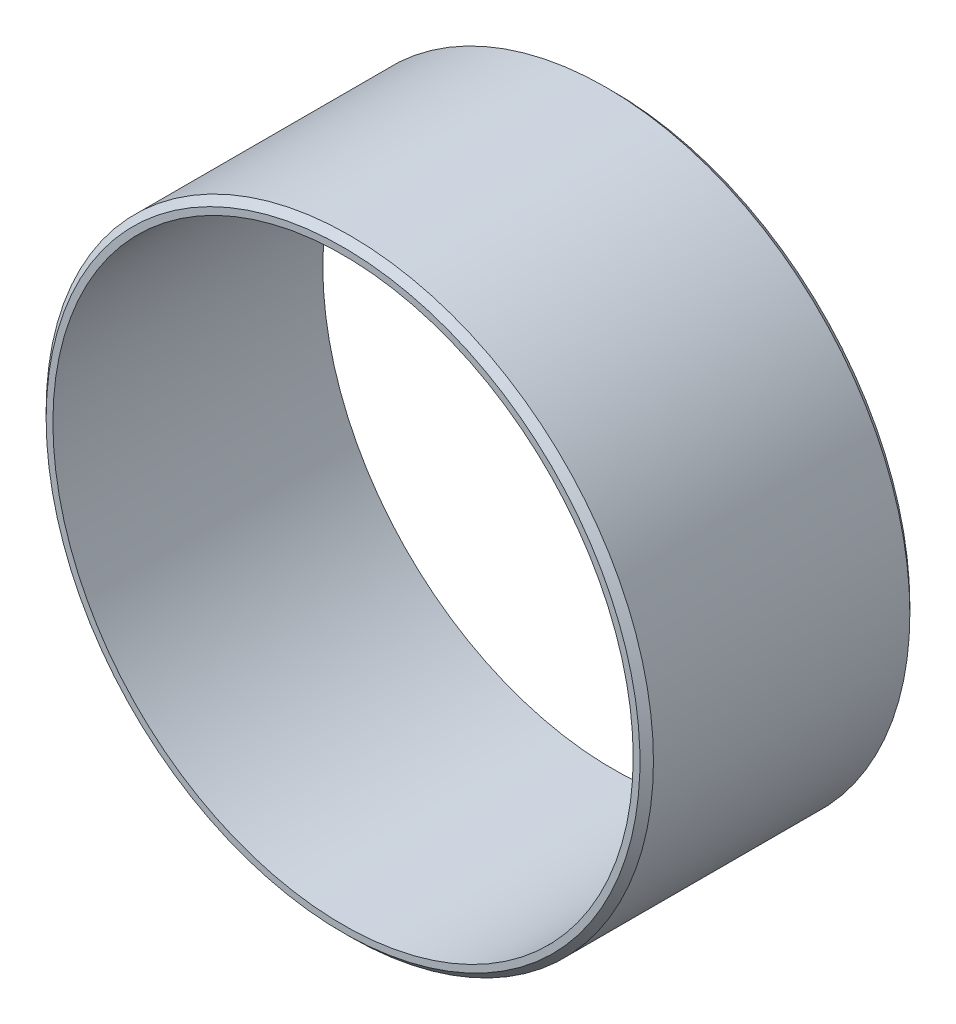
ISO-10303-21;
HEADER;
FILE_DESCRIPTION(('STEP AP214'),'2;1');
FILE_NAME('part.step','',(''),(''),'','','');
FILE_SCHEMA(('AUTOMOTIVE_DESIGN { 1 0 10303 214 1 1 1 1 }'));
ENDSEC;
DATA;
#1=APPLICATION_CONTEXT('core data for automotive mechanical design processes');
#2=APPLICATION_PROTOCOL_DEFINITION('international standard','automotive_design',2000,#1);
#3=PRODUCT_CONTEXT('',#1,'mechanical');
#4=PRODUCT('Part','Part','',(#3));
#5=PRODUCT_RELATED_PRODUCT_CATEGORY('part','',(#4));
#6=PRODUCT_DEFINITION_FORMATION('','',#4);
#7=PRODUCT_DEFINITION_CONTEXT('part definition',#1,'design');
#8=PRODUCT_DEFINITION('design','',#6,#7);
#9=PRODUCT_DEFINITION_SHAPE('','',#8);
#10=(LENGTH_UNIT() NAMED_UNIT(*) SI_UNIT(.MILLI.,.METRE.));
#11=(NAMED_UNIT(*) PLANE_ANGLE_UNIT() SI_UNIT($,.RADIAN.));
#12=(NAMED_UNIT(*) SI_UNIT($,.STERADIAN.) SOLID_ANGLE_UNIT());
#13=UNCERTAINTY_MEASURE_WITH_UNIT(LENGTH_MEASURE(1.E-05),#10,'distance_accuracy_value','');
#14=(GEOMETRIC_REPRESENTATION_CONTEXT(3) GLOBAL_UNCERTAINTY_ASSIGNED_CONTEXT((#13)) GLOBAL_UNIT_ASSIGNED_CONTEXT((#10,
#11,#12)) REPRESENTATION_CONTEXT('',''));
#15=CARTESIAN_POINT('',(0.,0.,0.));
#16=DIRECTION('',(0.,0.,1.));
#17=DIRECTION('',(1.,0.,0.));
#18=AXIS2_PLACEMENT_3D('',#15,#16,#17);
#19=CARTESIAN_POINT('',(0.,0.,40.));
#20=DIRECTION('',(0.,0.,-1.));
#21=DIRECTION('',(-1.,0.,0.));
#22=AXIS2_PLACEMENT_3D('',#19,#20,#21);
#23=CYLINDRICAL_SURFACE('',#22,45.);
#24=CARTESIAN_POINT('',(0.,0.,1.00000000000003));
#25=DIRECTION('',(0.,0.,1.));
#26=DIRECTION('',(1.,0.,0.));
#27=AXIS2_PLACEMENT_3D('',#24,#25,#26);
#28=CIRCLE('',#27,45.);
#29=CARTESIAN_POINT('',(45.,0.,1.00000000000003));
#30=VERTEX_POINT('',#29);
#31=EDGE_CURVE('E30',#30,#30,#28,.F.);
#32=ORIENTED_EDGE('',*,*,#31,.F.);
#33=EDGE_LOOP('',(#32));
#34=FACE_BOUND('',#33,.T.);
#35=CARTESIAN_POINT('',(0.,0.,39.));
#36=DIRECTION('',(0.,0.,-1.));
#37=DIRECTION('',(-1.,0.,0.));
#38=AXIS2_PLACEMENT_3D('',#35,#36,#37);
#39=CIRCLE('',#38,45.);
#40=CARTESIAN_POINT('',(-45.,0.,39.));
#41=VERTEX_POINT('',#40);
#42=EDGE_CURVE('E36',#41,#41,#39,.F.);
#43=ORIENTED_EDGE('',*,*,#42,.F.);
#44=EDGE_LOOP('',(#43));
#45=FACE_BOUND('',#44,.T.);
#46=ADVANCED_FACE('F15',(#34,#45),#23,.T.);
#47=CARTESIAN_POINT('',(0.,0.,1.00000000000003));
#48=DIRECTION('',(0.,0.,1.));
#49=DIRECTION('',(1.,0.,0.));
#50=AXIS2_PLACEMENT_3D('',#47,#48,#49);
#51=CONICAL_SURFACE('',#50,45.,0.785398163397452);
#52=CARTESIAN_POINT('',(0.,0.,0.));
#53=DIRECTION('',(0.,0.,1.));
#54=DIRECTION('',(1.,0.,0.));
#55=AXIS2_PLACEMENT_3D('',#52,#53,#54);
#56=CIRCLE('',#55,44.);
#57=CARTESIAN_POINT('',(44.,0.,0.));
#58=VERTEX_POINT('',#57);
#59=EDGE_CURVE('E18',#58,#58,#56,.T.);
#60=ORIENTED_EDGE('',*,*,#59,.T.);
#61=EDGE_LOOP('',(#60));
#62=FACE_BOUND('',#61,.T.);
#63=ORIENTED_EDGE('',*,*,#31,.T.);
#64=EDGE_LOOP('',(#63));
#65=FACE_BOUND('',#64,.T.);
#66=ADVANCED_FACE('F45',(#62,#65),#51,.T.);
#67=CARTESIAN_POINT('',(0.,0.,39.));
#68=DIRECTION('',(0.,0.,-1.));
#69=DIRECTION('',(-1.,0.,0.));
#70=AXIS2_PLACEMENT_3D('',#67,#68,#69);
#71=CONICAL_SURFACE('',#70,45.,0.785398163397452);
#72=ORIENTED_EDGE('',*,*,#42,.T.);
#73=EDGE_LOOP('',(#72));
#74=FACE_BOUND('',#73,.T.);
#75=CARTESIAN_POINT('',(0.,0.,40.));
#76=DIRECTION('',(0.,0.,-1.));
#77=DIRECTION('',(-1.,0.,0.));
#78=AXIS2_PLACEMENT_3D('',#75,#76,#77);
#79=CIRCLE('',#78,44.);
#80=CARTESIAN_POINT('',(-44.,0.,40.));
#81=VERTEX_POINT('',#80);
#82=EDGE_CURVE('E27',#81,#81,#79,.F.);
#83=ORIENTED_EDGE('',*,*,#82,.F.);
#84=EDGE_LOOP('',(#83));
#85=FACE_BOUND('',#84,.T.);
#86=ADVANCED_FACE('F53',(#74,#85),#71,.T.);
#87=CARTESIAN_POINT('',(0.,0.,0.));
#88=DIRECTION('',(0.,0.,1.));
#89=DIRECTION('',(1.,0.,0.));
#90=AXIS2_PLACEMENT_3D('',#87,#88,#89);
#91=PLANE('',#90);
#92=CARTESIAN_POINT('',(0.,0.,0.));
#93=DIRECTION('',(0.,0.,-1.));
#94=DIRECTION('',(-1.,0.,0.));
#95=AXIS2_PLACEMENT_3D('',#92,#93,#94);
#96=CIRCLE('',#95,43.);
#97=CARTESIAN_POINT('',(-43.,0.,0.));
#98=VERTEX_POINT('',#97);
#99=EDGE_CURVE('E22',#98,#98,#96,.F.);
#100=ORIENTED_EDGE('',*,*,#99,.T.);
#101=EDGE_LOOP('',(#100));
#102=FACE_BOUND('',#101,.T.);
#103=ORIENTED_EDGE('',*,*,#59,.F.);
#104=EDGE_LOOP('',(#103));
#105=FACE_BOUND('',#104,.T.);
#106=ADVANCED_FACE('F62',(#102,#105),#91,.F.);
#107=CARTESIAN_POINT('',(0.,0.,40.));
#108=DIRECTION('',(0.,0.,1.));
#109=DIRECTION('',(1.,0.,0.));
#110=AXIS2_PLACEMENT_3D('',#107,#108,#109);
#111=PLANE('',#110);
#112=CARTESIAN_POINT('',(0.,0.,40.));
#113=DIRECTION('',(0.,0.,-1.));
#114=DIRECTION('',(-1.,0.,0.));
#115=AXIS2_PLACEMENT_3D('',#112,#113,#114);
#116=CIRCLE('',#115,43.);
#117=CARTESIAN_POINT('',(-43.,0.,40.));
#118=VERTEX_POINT('',#117);
#119=EDGE_CURVE('E10',#118,#118,#116,.T.);
#120=ORIENTED_EDGE('',*,*,#119,.T.);
#121=EDGE_LOOP('',(#120));
#122=FACE_BOUND('',#121,.T.);
#123=ORIENTED_EDGE('',*,*,#82,.T.);
#124=EDGE_LOOP('',(#123));
#125=FACE_BOUND('',#124,.T.);
#126=ADVANCED_FACE('F56',(#122,#125),#111,.T.);
#127=CARTESIAN_POINT('',(0.,0.,40.));
#128=DIRECTION('',(0.,0.,-1.));
#129=DIRECTION('',(-1.,0.,0.));
#130=AXIS2_PLACEMENT_3D('',#127,#128,#129);
#131=CYLINDRICAL_SURFACE('',#130,43.);
#132=ORIENTED_EDGE('',*,*,#99,.F.);
#133=EDGE_LOOP('',(#132));
#134=FACE_BOUND('',#133,.T.);
#135=ORIENTED_EDGE('',*,*,#119,.F.);
#136=EDGE_LOOP('',(#135));
#137=FACE_BOUND('',#136,.T.);
#138=ADVANCED_FACE('F54',(#134,#137),#131,.F.);
#139=CLOSED_SHELL('',(#46,#66,#86,#106,#126,#138));
#140=MANIFOLD_SOLID_BREP('B1',#139);
#141=ADVANCED_BREP_SHAPE_REPRESENTATION('',(#18,#140),#14);
#142=SHAPE_DEFINITION_REPRESENTATION(#9,#141);
ENDSEC;
END-ISO-10303-21;
